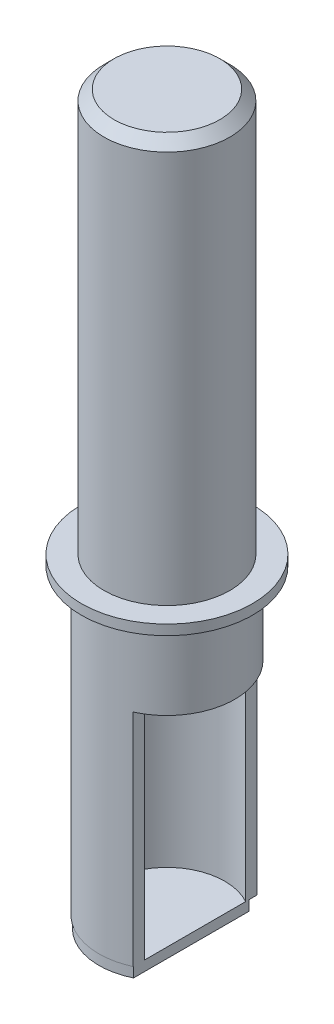
ISO-10303-21;
HEADER;
FILE_DESCRIPTION(('STEP AP214'),'2;1');
FILE_NAME('part.step','',(''),(''),'','','');
FILE_SCHEMA(('AUTOMOTIVE_DESIGN { 1 0 10303 214 1 1 1 1 }'));
ENDSEC;
DATA;
#1=APPLICATION_CONTEXT('core data for automotive mechanical design processes');
#2=APPLICATION_PROTOCOL_DEFINITION('international standard','automotive_design',2000,#1);
#3=PRODUCT_CONTEXT('',#1,'mechanical');
#4=PRODUCT('Part','Part','',(#3));
#5=PRODUCT_RELATED_PRODUCT_CATEGORY('part','',(#4));
#6=PRODUCT_DEFINITION_FORMATION('','',#4);
#7=PRODUCT_DEFINITION_CONTEXT('part definition',#1,'design');
#8=PRODUCT_DEFINITION('design','',#6,#7);
#9=PRODUCT_DEFINITION_SHAPE('','',#8);
#10=(LENGTH_UNIT() NAMED_UNIT(*) SI_UNIT(.MILLI.,.METRE.));
#11=(NAMED_UNIT(*) PLANE_ANGLE_UNIT() SI_UNIT($,.RADIAN.));
#12=(NAMED_UNIT(*) SI_UNIT($,.STERADIAN.) SOLID_ANGLE_UNIT());
#13=UNCERTAINTY_MEASURE_WITH_UNIT(LENGTH_MEASURE(1.E-05),#10,'distance_accuracy_value','');
#14=(GEOMETRIC_REPRESENTATION_CONTEXT(3) GLOBAL_UNCERTAINTY_ASSIGNED_CONTEXT((#13)) GLOBAL_UNIT_ASSIGNED_CONTEXT((#10,
#11,#12)) REPRESENTATION_CONTEXT('',''));
#15=CARTESIAN_POINT('',(0.,0.,0.));
#16=DIRECTION('',(0.,0.,1.));
#17=DIRECTION('',(1.,0.,0.));
#18=AXIS2_PLACEMENT_3D('',#15,#16,#17);
#19=CARTESIAN_POINT('',(0.,0.,0.));
#20=DIRECTION('',(0.,1.,0.));
#21=DIRECTION('',(0.,0.,1.));
#22=AXIS2_PLACEMENT_3D('',#19,#20,#21);
#23=PLANE('',#22);
#24=CARTESIAN_POINT('',(0.,0.,0.));
#25=DIRECTION('',(0.,1.,0.));
#26=DIRECTION('',(0.,0.,1.));
#27=AXIS2_PLACEMENT_3D('',#24,#25,#26);
#28=CIRCLE('',#27,13.5);
#29=CARTESIAN_POINT('',(5.57398345932145,0.,-12.2955564491897));
#30=VERTEX_POINT('',#29);
#31=CARTESIAN_POINT('',(0.,0.,13.5));
#32=VERTEX_POINT('',#31);
#33=EDGE_CURVE('E131',#30,#32,#28,.T.);
#34=ORIENTED_EDGE('',*,*,#33,.F.);
#35=DIRECTION('',(0.,0.,1.));
#36=VECTOR('',#35,1.);
#37=CARTESIAN_POINT('',(5.57398345932145,0.,0.));
#38=LINE('',#37,#36);
#39=CARTESIAN_POINT('',(5.57398345932145,0.,-10.7420354368216));
#40=VERTEX_POINT('',#39);
#41=EDGE_CURVE('E92',#30,#40,#38,.T.);
#42=ORIENTED_EDGE('',*,*,#41,.T.);
#43=CARTESIAN_POINT('',(0.,0.,0.738167864710704));
#44=DIRECTION('',(0.,-1.,0.));
#45=DIRECTION('',(0.,0.,-1.));
#46=AXIS2_PLACEMENT_3D('',#43,#44,#45);
#47=CIRCLE('',#46,12.7618321352893);
#48=EDGE_CURVE('E116',#32,#40,#47,.T.);
#49=ORIENTED_EDGE('',*,*,#48,.F.);
#50=EDGE_LOOP('',(#34,#42,#49));
#51=FACE_BOUND('',#50,.T.);
#52=ADVANCED_FACE('F33',(#51),#23,.F.);
#53=CARTESIAN_POINT('',(5.57398345932145,0.,12.218371166243));
#54=VERTEX_POINT('',#53);
#55=EDGE_CURVE('E113',#54,#32,#47,.T.);
#56=ORIENTED_EDGE('',*,*,#55,.F.);
#57=CARTESIAN_POINT('',(5.57398345932145,0.,12.2955564491897));
#58=VERTEX_POINT('',#57);
#59=EDGE_CURVE('E96',#54,#58,#38,.T.);
#60=ORIENTED_EDGE('',*,*,#59,.T.);
#61=EDGE_CURVE('E136',#32,#58,#28,.T.);
#62=ORIENTED_EDGE('',*,*,#61,.F.);
#63=EDGE_LOOP('',(#56,#60,#62));
#64=FACE_BOUND('',#63,.T.);
#65=ADVANCED_FACE('F173',(#64),#23,.F.);
#66=CARTESIAN_POINT('',(0.,60.,0.));
#67=DIRECTION('',(0.,-1.,0.));
#68=DIRECTION('',(0.,0.,-1.));
#69=AXIS2_PLACEMENT_3D('',#66,#67,#68);
#70=CYLINDRICAL_SURFACE('',#69,13.5);
#71=CARTESIAN_POINT('',(0.,60.,0.));
#72=DIRECTION('',(0.,1.,0.));
#73=DIRECTION('',(0.,0.,1.));
#74=AXIS2_PLACEMENT_3D('',#71,#72,#73);
#75=CIRCLE('',#74,13.5);
#76=CARTESIAN_POINT('',(0.,60.,13.5));
#77=VERTEX_POINT('',#76);
#78=EDGE_CURVE('E132',#77,#77,#75,.T.);
#79=ORIENTED_EDGE('',*,*,#78,.F.);
#80=EDGE_LOOP('',(#79));
#81=FACE_BOUND('',#80,.T.);
#82=CARTESIAN_POINT('',(0.,43.7924945651224,0.));
#83=DIRECTION('',(0.,1.,0.));
#84=DIRECTION('',(0.,0.,1.));
#85=AXIS2_PLACEMENT_3D('',#82,#83,#84);
#86=CIRCLE('',#85,13.5);
#87=CARTESIAN_POINT('',(5.57398345932145,43.7924945651224,12.2955564491897));
#88=VERTEX_POINT('',#87);
#89=CARTESIAN_POINT('',(5.57398345932145,43.7924945651224,-12.2955564491897));
#90=VERTEX_POINT('',#89);
#91=EDGE_CURVE('E102',#88,#90,#86,.T.);
#92=ORIENTED_EDGE('',*,*,#91,.T.);
#93=DIRECTION('',(0.,-1.,0.));
#94=VECTOR('',#93,1.);
#95=CARTESIAN_POINT('',(5.57398345932145,60.,-12.2955564491897));
#96=LINE('',#95,#94);
#97=EDGE_CURVE('E87',#90,#30,#96,.T.);
#98=ORIENTED_EDGE('',*,*,#97,.T.);
#99=ORIENTED_EDGE('',*,*,#33,.T.);
#100=ORIENTED_EDGE('',*,*,#61,.T.);
#101=DIRECTION('',(0.,-1.,0.));
#102=VECTOR('',#101,1.);
#103=CARTESIAN_POINT('',(5.57398345932145,60.,12.2955564491897));
#104=LINE('',#103,#102);
#105=EDGE_CURVE('E112',#58,#88,#104,.F.);
#106=ORIENTED_EDGE('',*,*,#105,.T.);
#107=EDGE_LOOP('',(#92,#98,#99,#100,#106));
#108=FACE_BOUND('',#107,.T.);
#109=ADVANCED_FACE('F110',(#81,#108),#70,.T.);
#110=CARTESIAN_POINT('',(0.,60.,0.));
#111=DIRECTION('',(0.,-1.,0.));
#112=DIRECTION('',(0.,0.,-1.));
#113=AXIS2_PLACEMENT_3D('',#110,#111,#112);
#114=CYLINDRICAL_SURFACE('',#113,11.5);
#115=DIRECTION('',(0.,-1.,0.));
#116=VECTOR('',#115,1.);
#117=CARTESIAN_POINT('',(5.57398345932145,60.,-10.0588621819374));
#118=LINE('',#117,#116);
#119=CARTESIAN_POINT('',(5.57398345932145,43.7924945651224,-10.0588621819374));
#120=VERTEX_POINT('',#119);
#121=CARTESIAN_POINT('',(5.57398345932145,0.,-10.0588621819374));
#122=VERTEX_POINT('',#121);
#123=EDGE_CURVE('E55',#120,#122,#118,.T.);
#124=ORIENTED_EDGE('',*,*,#123,.F.);
#125=CARTESIAN_POINT('',(0.,43.7924945651224,0.));
#126=DIRECTION('',(0.,1.,0.));
#127=DIRECTION('',(0.,0.,1.));
#128=AXIS2_PLACEMENT_3D('',#125,#126,#127);
#129=CIRCLE('',#128,11.5);
#130=CARTESIAN_POINT('',(5.57398345932145,43.7924945651224,10.0588621819374));
#131=VERTEX_POINT('',#130);
#132=EDGE_CURVE('E105',#131,#120,#129,.T.);
#133=ORIENTED_EDGE('',*,*,#132,.F.);
#134=DIRECTION('',(0.,-1.,0.));
#135=VECTOR('',#134,1.);
#136=CARTESIAN_POINT('',(5.57398345932145,60.,10.0588621819374));
#137=LINE('',#136,#135);
#138=CARTESIAN_POINT('',(5.57398345932145,0.,10.0588621819374));
#139=VERTEX_POINT('',#138);
#140=EDGE_CURVE('E106',#139,#131,#137,.F.);
#141=ORIENTED_EDGE('',*,*,#140,.F.);
#142=CARTESIAN_POINT('',(0.,0.,0.));
#143=DIRECTION('',(0.,1.,0.));
#144=DIRECTION('',(0.,0.,1.));
#145=AXIS2_PLACEMENT_3D('',#142,#143,#144);
#146=CIRCLE('',#145,11.5);
#147=EDGE_CURVE('E122',#122,#139,#146,.T.);
#148=ORIENTED_EDGE('',*,*,#147,.F.);
#149=EDGE_LOOP('',(#124,#133,#141,#148));
#150=FACE_BOUND('',#149,.T.);
#151=CARTESIAN_POINT('',(0.,60.,0.));
#152=DIRECTION('',(0.,1.,0.));
#153=DIRECTION('',(0.,0.,1.));
#154=AXIS2_PLACEMENT_3D('',#151,#152,#153);
#155=CIRCLE('',#154,11.5);
#156=CARTESIAN_POINT('',(0.,60.,11.5));
#157=VERTEX_POINT('',#156);
#158=EDGE_CURVE('E125',#157,#157,#155,.T.);
#159=ORIENTED_EDGE('',*,*,#158,.T.);
#160=EDGE_LOOP('',(#159));
#161=FACE_BOUND('',#160,.T.);
#162=ADVANCED_FACE('F179',(#150,#161),#114,.F.);
#163=CARTESIAN_POINT('',(0.,-2.,0.738167864710704));
#164=DIRECTION('',(0.,-1.,0.));
#165=DIRECTION('',(0.,0.,-1.));
#166=AXIS2_PLACEMENT_3D('',#163,#164,#165);
#167=PLANE('',#166);
#168=DIRECTION('',(0.,0.,-1.));
#169=VECTOR('',#168,1.);
#170=CARTESIAN_POINT('',(5.57398345932145,-2.,0.738167864710704));
#171=LINE('',#170,#169);
#172=CARTESIAN_POINT('',(5.57398345932145,-2.,12.218371166243));
#173=VERTEX_POINT('',#172);
#174=CARTESIAN_POINT('',(5.57398345932145,-2.,-10.7420354368216));
#175=VERTEX_POINT('',#174);
#176=EDGE_CURVE('E48',#173,#175,#171,.T.);
#177=ORIENTED_EDGE('',*,*,#176,.F.);
#178=CARTESIAN_POINT('',(0.,-2.,0.738167864710704));
#179=DIRECTION('',(0.,-1.,0.));
#180=DIRECTION('',(0.,0.,-1.));
#181=AXIS2_PLACEMENT_3D('',#178,#179,#180);
#182=CIRCLE('',#181,12.7618321352893);
#183=EDGE_CURVE('E120',#173,#175,#182,.T.);
#184=ORIENTED_EDGE('',*,*,#183,.T.);
#185=EDGE_LOOP('',(#177,#184));
#186=FACE_BOUND('',#185,.T.);
#187=ADVANCED_FACE('F177',(#186),#167,.T.);
#188=CARTESIAN_POINT('',(0.,-2.,0.738167864710704));
#189=DIRECTION('',(0.,1.,0.));
#190=DIRECTION('',(0.,0.,1.));
#191=AXIS2_PLACEMENT_3D('',#188,#189,#190);
#192=CYLINDRICAL_SURFACE('',#191,12.7618321352893);
#193=ORIENTED_EDGE('',*,*,#183,.F.);
#194=DIRECTION('',(0.,1.,0.));
#195=VECTOR('',#194,1.);
#196=CARTESIAN_POINT('',(5.57398345932145,-2.,12.218371166243));
#197=LINE('',#196,#195);
#198=EDGE_CURVE('E97',#173,#54,#197,.T.);
#199=ORIENTED_EDGE('',*,*,#198,.T.);
#200=ORIENTED_EDGE('',*,*,#55,.T.);
#201=ORIENTED_EDGE('',*,*,#48,.T.);
#202=DIRECTION('',(0.,1.,0.));
#203=VECTOR('',#202,1.);
#204=CARTESIAN_POINT('',(5.57398345932145,-2.,-10.7420354368216));
#205=LINE('',#204,#203);
#206=EDGE_CURVE('E161',#40,#175,#205,.F.);
#207=ORIENTED_EDGE('',*,*,#206,.T.);
#208=EDGE_LOOP('',(#193,#199,#200,#201,#207));
#209=FACE_BOUND('',#208,.T.);
#210=ADVANCED_FACE('F169',(#209),#192,.T.);
#211=CARTESIAN_POINT('',(0.,0.,0.738167864710704));
#212=DIRECTION('',(0.,-1.,0.));
#213=DIRECTION('',(0.,0.,-1.));
#214=AXIS2_PLACEMENT_3D('',#211,#212,#213);
#215=PLANE('',#214);
#216=ORIENTED_EDGE('',*,*,#147,.T.);
#217=DIRECTION('',(0.,0.,-1.));
#218=VECTOR('',#217,1.);
#219=CARTESIAN_POINT('',(5.57398345932145,0.,0.738167864710704));
#220=LINE('',#219,#218);
#221=EDGE_CURVE('E135',#139,#122,#220,.T.);
#222=ORIENTED_EDGE('',*,*,#221,.T.);
#223=EDGE_LOOP('',(#216,#222));
#224=FACE_BOUND('',#223,.T.);
#225=ADVANCED_FACE('F185',(#224),#215,.F.);
#226=CARTESIAN_POINT('',(26.7265360741824,43.7924945651224,-13.5));
#227=DIRECTION('',(0.,1.,0.));
#228=DIRECTION('',(0.,0.,1.));
#229=AXIS2_PLACEMENT_3D('',#226,#227,#228);
#230=PLANE('',#229);
#231=DIRECTION('',(0.,0.,1.));
#232=VECTOR('',#231,1.);
#233=CARTESIAN_POINT('',(5.57398345932145,43.7924945651224,-13.5));
#234=LINE('',#233,#232);
#235=EDGE_CURVE('E107',#131,#88,#234,.T.);
#236=ORIENTED_EDGE('',*,*,#235,.F.);
#237=ORIENTED_EDGE('',*,*,#132,.T.);
#238=EDGE_CURVE('E90',#90,#120,#234,.T.);
#239=ORIENTED_EDGE('',*,*,#238,.F.);
#240=ORIENTED_EDGE('',*,*,#91,.F.);
#241=EDGE_LOOP('',(#236,#237,#239,#240));
#242=FACE_BOUND('',#241,.T.);
#243=ADVANCED_FACE('F101',(#242),#230,.F.);
#244=CARTESIAN_POINT('',(5.57398345932145,-8.23135105521138,-13.5));
#245=DIRECTION('',(-1.,0.,0.));
#246=DIRECTION('',(0.,0.,1.));
#247=AXIS2_PLACEMENT_3D('',#244,#245,#246);
#248=PLANE('',#247);
#249=ORIENTED_EDGE('',*,*,#59,.F.);
#250=ORIENTED_EDGE('',*,*,#198,.F.);
#251=ORIENTED_EDGE('',*,*,#176,.T.);
#252=ORIENTED_EDGE('',*,*,#206,.F.);
#253=ORIENTED_EDGE('',*,*,#41,.F.);
#254=ORIENTED_EDGE('',*,*,#97,.F.);
#255=ORIENTED_EDGE('',*,*,#238,.T.);
#256=ORIENTED_EDGE('',*,*,#123,.T.);
#257=ORIENTED_EDGE('',*,*,#221,.F.);
#258=ORIENTED_EDGE('',*,*,#140,.T.);
#259=ORIENTED_EDGE('',*,*,#235,.T.);
#260=ORIENTED_EDGE('',*,*,#105,.F.);
#261=EDGE_LOOP('',(#249,#250,#251,#252,#253,#254,#255,#256,#257,#258,#259,#260));
#262=FACE_BOUND('',#261,.T.);
#263=ADVANCED_FACE('F89',(#262),#248,.F.);
#264=CARTESIAN_POINT('',(0.,60.,0.));
#265=DIRECTION('',(0.,1.,0.));
#266=DIRECTION('',(0.,0.,1.));
#267=AXIS2_PLACEMENT_3D('',#264,#265,#266);
#268=PLANE('',#267);
#269=CARTESIAN_POINT('',(0.,60.,0.));
#270=DIRECTION('',(0.,1.,0.));
#271=DIRECTION('',(0.,0.,1.));
#272=AXIS2_PLACEMENT_3D('',#269,#270,#271);
#273=CIRCLE('',#272,3.);
#274=CARTESIAN_POINT('',(0.,60.,3.));
#275=VERTEX_POINT('',#274);
#276=EDGE_CURVE('E151',#275,#275,#273,.T.);
#277=ORIENTED_EDGE('',*,*,#276,.T.);
#278=EDGE_LOOP('',(#277));
#279=FACE_BOUND('',#278,.T.);
#280=ORIENTED_EDGE('',*,*,#158,.F.);
#281=EDGE_LOOP('',(#280));
#282=FACE_BOUND('',#281,.T.);
#283=ADVANCED_FACE('F208',(#279,#282),#268,.F.);
#284=CARTESIAN_POINT('',(0.,62.,0.));
#285=DIRECTION('',(0.,1.,0.));
#286=DIRECTION('',(0.,0.,1.));
#287=AXIS2_PLACEMENT_3D('',#284,#285,#286);
#288=PLANE('',#287);
#289=CARTESIAN_POINT('',(0.,62.,0.));
#290=DIRECTION('',(0.,1.,0.));
#291=DIRECTION('',(0.,0.,1.));
#292=AXIS2_PLACEMENT_3D('',#289,#290,#291);
#293=CIRCLE('',#292,12.5);
#294=CARTESIAN_POINT('',(0.,62.,12.5));
#295=VERTEX_POINT('',#294);
#296=EDGE_CURVE('E139',#295,#295,#293,.T.);
#297=ORIENTED_EDGE('',*,*,#296,.F.);
#298=EDGE_LOOP('',(#297));
#299=FACE_BOUND('',#298,.T.);
#300=CARTESIAN_POINT('',(0.,62.,0.));
#301=DIRECTION('',(0.,1.,0.));
#302=DIRECTION('',(0.,0.,1.));
#303=AXIS2_PLACEMENT_3D('',#300,#301,#302);
#304=CIRCLE('',#303,17.);
#305=CARTESIAN_POINT('',(0.,62.,17.));
#306=VERTEX_POINT('',#305);
#307=EDGE_CURVE('E128',#306,#306,#304,.T.);
#308=ORIENTED_EDGE('',*,*,#307,.T.);
#309=EDGE_LOOP('',(#308));
#310=FACE_BOUND('',#309,.T.);
#311=ADVANCED_FACE('F206',(#299,#310),#288,.T.);
#312=ORIENTED_EDGE('',*,*,#78,.T.);
#313=EDGE_LOOP('',(#312));
#314=FACE_BOUND('',#313,.T.);
#315=CARTESIAN_POINT('',(0.,60.,0.));
#316=DIRECTION('',(0.,1.,0.));
#317=DIRECTION('',(0.,0.,1.));
#318=AXIS2_PLACEMENT_3D('',#315,#316,#317);
#319=CIRCLE('',#318,17.);
#320=CARTESIAN_POINT('',(0.,60.,17.));
#321=VERTEX_POINT('',#320);
#322=EDGE_CURVE('E154',#321,#321,#319,.T.);
#323=ORIENTED_EDGE('',*,*,#322,.F.);
#324=EDGE_LOOP('',(#323));
#325=FACE_BOUND('',#324,.T.);
#326=ADVANCED_FACE('F202',(#314,#325),#268,.F.);
#327=CARTESIAN_POINT('',(0.,62.,0.));
#328=DIRECTION('',(0.,-1.,0.));
#329=DIRECTION('',(0.,0.,-1.));
#330=AXIS2_PLACEMENT_3D('',#327,#328,#329);
#331=CYLINDRICAL_SURFACE('',#330,17.);
#332=ORIENTED_EDGE('',*,*,#307,.F.);
#333=EDGE_LOOP('',(#332));
#334=FACE_BOUND('',#333,.T.);
#335=ORIENTED_EDGE('',*,*,#322,.T.);
#336=EDGE_LOOP('',(#335));
#337=FACE_BOUND('',#336,.T.);
#338=ADVANCED_FACE('F205',(#334,#337),#331,.T.);
#339=CARTESIAN_POINT('',(0.,62.,0.));
#340=DIRECTION('',(0.,-1.,0.));
#341=DIRECTION('',(0.,0.,-1.));
#342=AXIS2_PLACEMENT_3D('',#339,#340,#341);
#343=CYLINDRICAL_SURFACE('',#342,3.);
#344=CARTESIAN_POINT('',(0.,62.,0.));
#345=DIRECTION('',(0.,1.,0.));
#346=DIRECTION('',(0.,0.,1.));
#347=AXIS2_PLACEMENT_3D('',#344,#345,#346);
#348=CIRCLE('',#347,3.);
#349=CARTESIAN_POINT('',(0.,62.,3.));
#350=VERTEX_POINT('',#349);
#351=EDGE_CURVE('E148',#350,#350,#348,.T.);
#352=ORIENTED_EDGE('',*,*,#351,.T.);
#353=EDGE_LOOP('',(#352));
#354=FACE_BOUND('',#353,.T.);
#355=ORIENTED_EDGE('',*,*,#276,.F.);
#356=EDGE_LOOP('',(#355));
#357=FACE_BOUND('',#356,.T.);
#358=ADVANCED_FACE('F212',(#354,#357),#343,.F.);
#359=CARTESIAN_POINT('',(0.,142.,0.));
#360=DIRECTION('',(0.,1.,0.));
#361=DIRECTION('',(0.,0.,1.));
#362=AXIS2_PLACEMENT_3D('',#359,#360,#361);
#363=PLANE('',#362);
#364=CARTESIAN_POINT('',(0.,142.,0.));
#365=DIRECTION('',(0.,1.,0.));
#366=DIRECTION('',(0.,0.,1.));
#367=AXIS2_PLACEMENT_3D('',#364,#365,#366);
#368=CIRCLE('',#367,10.5);
#369=CARTESIAN_POINT('',(0.,142.,10.5));
#370=VERTEX_POINT('',#369);
#371=EDGE_CURVE('E41',#370,#370,#368,.T.);
#372=ORIENTED_EDGE('',*,*,#371,.T.);
#373=EDGE_LOOP('',(#372));
#374=FACE_BOUND('',#373,.T.);
#375=ADVANCED_FACE('F218',(#374),#363,.T.);
#376=CARTESIAN_POINT('',(0.,142.,0.));
#377=DIRECTION('',(0.,-1.,0.));
#378=DIRECTION('',(0.,0.,-1.));
#379=AXIS2_PLACEMENT_3D('',#376,#377,#378);
#380=CYLINDRICAL_SURFACE('',#379,12.5);
#381=CARTESIAN_POINT('',(0.,140.,0.));
#382=DIRECTION('',(0.,1.,0.));
#383=DIRECTION('',(0.,0.,1.));
#384=AXIS2_PLACEMENT_3D('',#381,#382,#383);
#385=CIRCLE('',#384,12.5);
#386=CARTESIAN_POINT('',(0.,140.,12.5));
#387=VERTEX_POINT('',#386);
#388=EDGE_CURVE('E11',#387,#387,#385,.F.);
#389=ORIENTED_EDGE('',*,*,#388,.T.);
#390=EDGE_LOOP('',(#389));
#391=FACE_BOUND('',#390,.T.);
#392=ORIENTED_EDGE('',*,*,#296,.T.);
#393=EDGE_LOOP('',(#392));
#394=FACE_BOUND('',#393,.T.);
#395=ADVANCED_FACE('F249',(#391,#394),#380,.T.);
#396=CARTESIAN_POINT('',(0.,62.,0.));
#397=DIRECTION('',(0.,1.,0.));
#398=DIRECTION('',(0.,0.,1.));
#399=AXIS2_PLACEMENT_3D('',#396,#397,#398);
#400=PLANE('',#399);
#401=ORIENTED_EDGE('',*,*,#351,.F.);
#402=EDGE_LOOP('',(#401));
#403=FACE_BOUND('',#402,.T.);
#404=ADVANCED_FACE('F252',(#403),#400,.F.);
#405=CARTESIAN_POINT('',(0.,142.,0.));
#406=DIRECTION('',(0.,-1.,0.));
#407=DIRECTION('',(0.,0.,-1.));
#408=AXIS2_PLACEMENT_3D('',#405,#406,#407);
#409=CONICAL_SURFACE('',#408,10.5,0.785398163397449);
#410=ORIENTED_EDGE('',*,*,#388,.F.);
#411=EDGE_LOOP('',(#410));
#412=FACE_BOUND('',#411,.T.);
#413=ORIENTED_EDGE('',*,*,#371,.F.);
#414=EDGE_LOOP('',(#413));
#415=FACE_BOUND('',#414,.T.);
#416=ADVANCED_FACE('F35',(#412,#415),#409,.T.);
#417=CLOSED_SHELL('',(#52,#65,#109,#162,#187,#210,#225,#243,#263,#283,#311,#326,#338,#358,#375,
#395,#404,#416));
#418=MANIFOLD_SOLID_BREP('B2',#417);
#419=ADVANCED_BREP_SHAPE_REPRESENTATION('',(#18,#418),#14);
#420=SHAPE_DEFINITION_REPRESENTATION(#9,#419);
ENDSEC;
END-ISO-10303-21;
